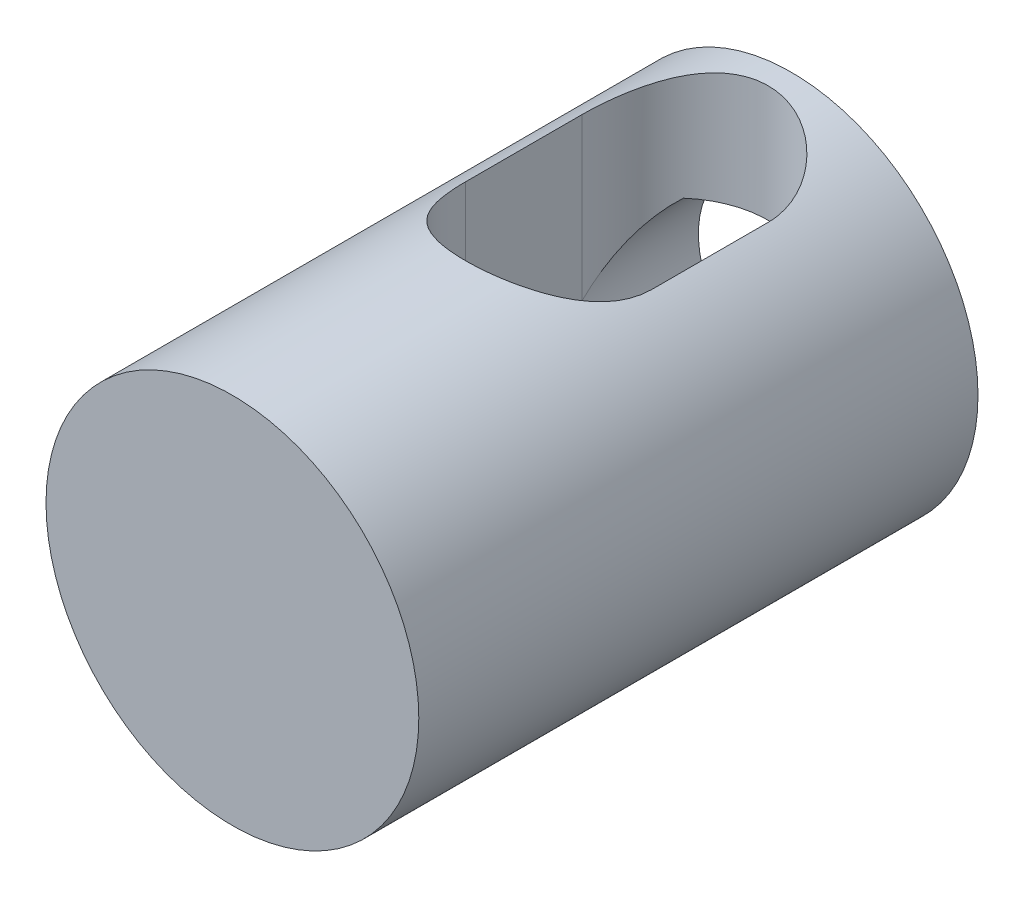
ISO-10303-21;
HEADER;
FILE_DESCRIPTION(('STEP AP214'),'2;1');
FILE_NAME('part.step','',(''),(''),'','','');
FILE_SCHEMA(('AUTOMOTIVE_DESIGN { 1 0 10303 214 1 1 1 1 }'));
ENDSEC;
DATA;
#1=APPLICATION_CONTEXT('core data for automotive mechanical design processes');
#2=APPLICATION_PROTOCOL_DEFINITION('international standard','automotive_design',2000,#1);
#3=PRODUCT_CONTEXT('',#1,'mechanical');
#4=PRODUCT('Part','Part','',(#3));
#5=PRODUCT_RELATED_PRODUCT_CATEGORY('part','',(#4));
#6=PRODUCT_DEFINITION_FORMATION('','',#4);
#7=PRODUCT_DEFINITION_CONTEXT('part definition',#1,'design');
#8=PRODUCT_DEFINITION('design','',#6,#7);
#9=PRODUCT_DEFINITION_SHAPE('','',#8);
#10=(LENGTH_UNIT() NAMED_UNIT(*) SI_UNIT(.MILLI.,.METRE.));
#11=(NAMED_UNIT(*) PLANE_ANGLE_UNIT() SI_UNIT($,.RADIAN.));
#12=(NAMED_UNIT(*) SI_UNIT($,.STERADIAN.) SOLID_ANGLE_UNIT());
#13=UNCERTAINTY_MEASURE_WITH_UNIT(LENGTH_MEASURE(1.E-05),#10,'distance_accuracy_value','');
#14=(GEOMETRIC_REPRESENTATION_CONTEXT(3) GLOBAL_UNCERTAINTY_ASSIGNED_CONTEXT((#13)) GLOBAL_UNIT_ASSIGNED_CONTEXT((#10,
#11,#12)) REPRESENTATION_CONTEXT('',''));
#15=CARTESIAN_POINT('',(0.,0.,0.));
#16=DIRECTION('',(0.,0.,1.));
#17=DIRECTION('',(1.,0.,0.));
#18=AXIS2_PLACEMENT_3D('',#15,#16,#17);
#19=CARTESIAN_POINT('',(-1.3228756555323,1.5,8.));
#20=DIRECTION('',(0.,1.,0.));
#21=DIRECTION('',(0.,0.,1.));
#22=AXIS2_PLACEMENT_3D('',#19,#20,#21);
#23=PLANE('',#22);
#24=DIRECTION('',(0.,0.,-1.));
#25=VECTOR('',#24,1.);
#26=CARTESIAN_POINT('',(1.3228756555323,1.5,8.));
#27=LINE('',#26,#25);
#28=CARTESIAN_POINT('',(1.3228756555323,1.5,1.));
#29=VERTEX_POINT('',#28);
#30=CARTESIAN_POINT('',(1.3228756555323,1.5,0.));
#31=VERTEX_POINT('',#30);
#32=EDGE_CURVE('E212',#29,#31,#27,.T.);
#33=ORIENTED_EDGE('',*,*,#32,.F.);
#34=CARTESIAN_POINT('',(0.,1.5,2.5));
#35=DIRECTION('',(0.,-1.,0.));
#36=DIRECTION('',(0.,0.,-1.));
#37=AXIS2_PLACEMENT_3D('',#34,#35,#36);
#38=CIRCLE('',#37,2.);
#39=CARTESIAN_POINT('',(-1.3228756555323,1.5,1.));
#40=VERTEX_POINT('',#39);
#41=EDGE_CURVE('E132',#40,#29,#38,.T.);
#42=ORIENTED_EDGE('',*,*,#41,.F.);
#43=DIRECTION('',(0.,0.,-1.));
#44=VECTOR('',#43,1.);
#45=CARTESIAN_POINT('',(-1.3228756555323,1.5,8.));
#46=LINE('',#45,#44);
#47=CARTESIAN_POINT('',(-1.3228756555323,1.5,0.));
#48=VERTEX_POINT('',#47);
#49=EDGE_CURVE('E213',#40,#48,#46,.T.);
#50=ORIENTED_EDGE('',*,*,#49,.T.);
#51=DIRECTION('',(1.,0.,0.));
#52=VECTOR('',#51,1.);
#53=CARTESIAN_POINT('',(-1.3228756555323,1.5,0.));
#54=LINE('',#53,#52);
#55=EDGE_CURVE('E196',#48,#31,#54,.T.);
#56=ORIENTED_EDGE('',*,*,#55,.T.);
#57=EDGE_LOOP('',(#33,#42,#50,#56));
#58=FACE_BOUND('',#57,.T.);
#59=ADVANCED_FACE('F37',(#58),#23,.F.);
#60=CARTESIAN_POINT('',(0.,0.,0.));
#61=DIRECTION('',(0.,0.,1.));
#62=DIRECTION('',(1.,0.,0.));
#63=AXIS2_PLACEMENT_3D('',#60,#61,#62);
#64=PLANE('',#63);
#65=CARTESIAN_POINT('',(0.,0.,0.));
#66=DIRECTION('',(0.,0.,1.));
#67=DIRECTION('',(1.,0.,0.));
#68=AXIS2_PLACEMENT_3D('',#65,#66,#67);
#69=CIRCLE('',#68,4.);
#70=CARTESIAN_POINT('',(4.,0.,0.));
#71=VERTEX_POINT('',#70);
#72=EDGE_CURVE('E42',#71,#71,#69,.T.);
#73=ORIENTED_EDGE('',*,*,#72,.F.);
#74=EDGE_LOOP('',(#73));
#75=FACE_BOUND('',#74,.T.);
#76=CARTESIAN_POINT('',(0.,0.,0.));
#77=DIRECTION('',(0.,0.,1.));
#78=DIRECTION('',(1.,0.,0.));
#79=AXIS2_PLACEMENT_3D('',#76,#77,#78);
#80=CIRCLE('',#79,2.);
#81=EDGE_CURVE('E194',#48,#31,#80,.T.);
#82=ORIENTED_EDGE('',*,*,#81,.T.);
#83=ORIENTED_EDGE('',*,*,#55,.F.);
#84=EDGE_LOOP('',(#82,#83));
#85=FACE_BOUND('',#84,.T.);
#86=ADVANCED_FACE('F178',(#75,#85),#64,.F.);
#87=CARTESIAN_POINT('',(0.,0.,12.));
#88=DIRECTION('',(0.,0.,-1.));
#89=DIRECTION('',(-1.,0.,0.));
#90=AXIS2_PLACEMENT_3D('',#87,#88,#89);
#91=CYLINDRICAL_SURFACE('',#90,4.);
#92=DIRECTION('',(0.,0.,-1.));
#93=VECTOR('',#92,1.);
#94=CARTESIAN_POINT('',(-2.,3.46410161513775,12.));
#95=LINE('',#94,#93);
#96=CARTESIAN_POINT('',(-2.,3.46410161513775,5.));
#97=VERTEX_POINT('',#96);
#98=CARTESIAN_POINT('',(-2.,3.46410161513775,2.5));
#99=VERTEX_POINT('',#98);
#100=EDGE_CURVE('E198',#97,#99,#95,.T.);
#101=ORIENTED_EDGE('',*,*,#100,.T.);
#102=CARTESIAN_POINT('',(-2.,3.46410161513775,2.5));
#103=CARTESIAN_POINT('',(-2.00000943869001,3.46408620970987,2.44762205197468));
#104=CARTESIAN_POINT('',(-1.99794273869158,3.46528916979241,2.39525266417875));
#105=CARTESIAN_POINT('',(-1.98973134530659,3.47001582547733,2.29097128012435));
#106=CARTESIAN_POINT('',(-1.98358915744987,3.47353809520359,2.23905902268741));
#107=CARTESIAN_POINT('',(-1.96734758392331,3.48276113120576,2.13636197380458));
#108=CARTESIAN_POINT('',(-1.95727108055602,3.48844929580341,2.08557242562939));
#109=CARTESIAN_POINT('',(-1.93329379612757,3.50179425827599,1.98517790872982));
#110=CARTESIAN_POINT('',(-1.91939257579649,3.5094512822684,1.93557307678209));
#111=CARTESIAN_POINT('',(-1.87223751000493,3.53496971479961,1.78922877472877));
#112=CARTESIAN_POINT('',(-1.83348206518134,3.55540886386695,1.69464885817499));
#113=CARTESIAN_POINT('',(-1.74260973580062,3.60081691495323,1.51326645129973));
#114=CARTESIAN_POINT('',(-1.69047214803723,3.62579281802088,1.42647629569109));
#115=CARTESIAN_POINT('',(-1.56932700935895,3.67994024124641,1.25538308608975));
#116=CARTESIAN_POINT('',(-1.49928845749502,3.70928784184414,1.17186401688438));
#117=CARTESIAN_POINT('',(-1.34648855278875,3.76744628526356,1.01716582823638));
#118=CARTESIAN_POINT('',(-1.2637237596621,3.79625698057539,0.945990056660703));
#119=CARTESIAN_POINT('',(-1.08097958990492,3.852429394718,0.813266342092416));
#120=CARTESIAN_POINT('',(-0.980215181611717,3.87956191127973,0.752693032009841));
#121=CARTESIAN_POINT('',(-0.768314880691173,3.92701497394428,0.64971851871349));
#122=CARTESIAN_POINT('',(-0.657185507148497,3.94733976534538,0.607305985825046));
#123=CARTESIAN_POINT('',(-0.436090764194855,3.97760910429472,0.544990946073144));
#124=CARTESIAN_POINT('',(-0.326605376453688,3.98818943198116,0.523701300599242));
#125=CARTESIAN_POINT('',(-0.105143090997525,4.00015165315059,0.499667803443515));
#126=CARTESIAN_POINT('',(0.00683230076447052,4.0015389624913,0.496913032347213));
#127=CARTESIAN_POINT('',(0.219666020360653,3.99525960973526,0.509493405564554));
#128=CARTESIAN_POINT('',(0.320644329924759,3.98836978544159,0.523276291844412));
#129=CARTESIAN_POINT('',(0.518629401924054,3.96748463780782,0.565762240252354));
#130=CARTESIAN_POINT('',(0.615635942593483,3.9534889182895,0.594466134280342));
#131=CARTESIAN_POINT('',(0.804618074137879,3.91943179430851,0.666164848265792));
#132=CARTESIAN_POINT('',(0.896505473959439,3.89928913517567,0.709351924229925));
#133=CARTESIAN_POINT('',(1.0719523739539,3.85475327589208,0.808526063503472));
#134=CARTESIAN_POINT('',(1.15550875300778,3.83035849206883,0.864517898283785));
#135=CARTESIAN_POINT('',(1.32034170525748,3.77688971838165,0.993786080741428));
#136=CARTESIAN_POINT('',(1.40065758878075,3.74759139866565,1.06819544818469));
#137=CARTESIAN_POINT('',(1.54820014968351,3.6890905267488,1.22916916122002));
#138=CARTESIAN_POINT('',(1.61541504384544,3.65988808377385,1.31574432958672));
#139=CARTESIAN_POINT('',(1.73905371288663,3.60286331192321,1.5053594541426));
#140=CARTESIAN_POINT('',(1.79450839108784,3.57524975585781,1.6090994171856));
#141=CARTESIAN_POINT('',(1.88669118631508,3.52747996877226,1.82604597477595));
#142=CARTESIAN_POINT('',(1.92346416437439,3.50730590530613,1.93922912407418));
#143=CARTESIAN_POINT('',(1.96647223368324,3.48329612458051,2.12782183056156));
#144=CARTESIAN_POINT('',(1.97899117486891,3.47616914725418,2.20142595230316));
#145=CARTESIAN_POINT('',(1.99577612591724,3.46654103519923,2.3499929359233));
#146=CARTESIAN_POINT('',(2.00002756701619,3.4640480667353,2.42495796182794));
#147=CARTESIAN_POINT('',(2.,3.46410161513775,2.5));
#148=B_SPLINE_CURVE_WITH_KNOTS('',3,(#102,#103,#104,#105,#106,#107,#108,#109,#110,#111,#112,
#113,#114,#115,#116,#117,#118,#119,#120,#121,#122,#123,#124,#125,#126,#127,#128,#129,#130,#131,
#132,#133,#134,#135,#136,#137,#138,#139,#140,#141,#142,#143,#144,#145,#146,#147),.UNSPECIFIED.,
.F.,.F.,(4,2,2,2,2,2,2,2,2,2,2,2,2,2,2,2,2,2,2,2,2,2,4),(0.,0.157065244429688,0.31403401759065,
0.470103130002185,0.626190174486594,0.937427814388438,1.24914989609589,1.58636722175674,
1.92367586815313,2.28376091120869,2.643620985295,2.97787141914153,3.31192491942518,
3.61692930404831,3.92195069558821,4.23119285312315,4.54055043268371,4.87912635702851,
5.21800541026928,5.57862778091816,5.93838003367367,6.16281283132481,6.38764076123999),.UNSPECIFIED.);
#149=CARTESIAN_POINT('',(2.,3.46410161513775,2.5));
#150=VERTEX_POINT('',#149);
#151=EDGE_CURVE('E147',#99,#150,#148,.T.);
#152=ORIENTED_EDGE('',*,*,#151,.T.);
#153=DIRECTION('',(0.,0.,-1.));
#154=VECTOR('',#153,1.);
#155=CARTESIAN_POINT('',(2.,3.46410161513775,12.));
#156=LINE('',#155,#154);
#157=CARTESIAN_POINT('',(2.,3.46410161513775,5.));
#158=VERTEX_POINT('',#157);
#159=EDGE_CURVE('E203',#150,#158,#156,.F.);
#160=ORIENTED_EDGE('',*,*,#159,.T.);
#161=CARTESIAN_POINT('',(2.,3.46410161513775,5.));
#162=CARTESIAN_POINT('',(2.00000943869001,3.46408620970987,5.05237794802532));
#163=CARTESIAN_POINT('',(1.99794273869158,3.46528916979241,5.10474733582125));
#164=CARTESIAN_POINT('',(1.98973134530659,3.47001582547733,5.20902871987565));
#165=CARTESIAN_POINT('',(1.98358915744987,3.47353809520359,5.26094097731259));
#166=CARTESIAN_POINT('',(1.96734758392331,3.48276113120576,5.36363802619542));
#167=CARTESIAN_POINT('',(1.95727108055602,3.48844929580341,5.41442757437061));
#168=CARTESIAN_POINT('',(1.93329379612757,3.50179425827599,5.51482209127018));
#169=CARTESIAN_POINT('',(1.91939257579648,3.5094512822684,5.56442692321791));
#170=CARTESIAN_POINT('',(1.87223751000493,3.53496971479961,5.71077122527123));
#171=CARTESIAN_POINT('',(1.83348206518134,3.55540886386695,5.80535114182501));
#172=CARTESIAN_POINT('',(1.74260973580062,3.60081691495323,5.98673354870027));
#173=CARTESIAN_POINT('',(1.69047214803722,3.62579281802088,6.07352370430891));
#174=CARTESIAN_POINT('',(1.56932700935895,3.67994024124641,6.24461691391025));
#175=CARTESIAN_POINT('',(1.49928845749502,3.70928784184414,6.32813598311562));
#176=CARTESIAN_POINT('',(1.34648855278875,3.76744628526356,6.48283417176362));
#177=CARTESIAN_POINT('',(1.2637237596621,3.79625698057539,6.5540099433393));
#178=CARTESIAN_POINT('',(1.08097958990492,3.852429394718,6.68673365790758));
#179=CARTESIAN_POINT('',(0.980215181611715,3.87956191127973,6.74730696799016));
#180=CARTESIAN_POINT('',(0.768314880691171,3.92701497394428,6.85028148128651));
#181=CARTESIAN_POINT('',(0.657185507148495,3.94733976534538,6.89269401417496));
#182=CARTESIAN_POINT('',(0.436090764194853,3.97760910429472,6.95500905392686));
#183=CARTESIAN_POINT('',(0.326605376453686,3.98818943198116,6.97629869940076));
#184=CARTESIAN_POINT('',(0.105143090997523,4.00015165315059,7.00033219655649));
#185=CARTESIAN_POINT('',(-0.00683230076447186,4.0015389624913,7.00308696765279));
#186=CARTESIAN_POINT('',(-0.219666020360655,3.99525960973526,6.99050659443545));
#187=CARTESIAN_POINT('',(-0.32064432992476,3.98836978544159,6.97672370815559));
#188=CARTESIAN_POINT('',(-0.518629401924055,3.96748463780782,6.93423775974765));
#189=CARTESIAN_POINT('',(-0.615635942593484,3.9534889182895,6.90553386571966));
#190=CARTESIAN_POINT('',(-0.80461807413788,3.91943179430851,6.83383515173421));
#191=CARTESIAN_POINT('',(-0.896505473959441,3.89928913517567,6.79064807577007));
#192=CARTESIAN_POINT('',(-1.07195237395391,3.85475327589208,6.69147393649653));
#193=CARTESIAN_POINT('',(-1.15550875300778,3.83035849206883,6.63548210171621));
#194=CARTESIAN_POINT('',(-1.32034170525748,3.77688971838165,6.50621391925857));
#195=CARTESIAN_POINT('',(-1.40065758878075,3.74759139866565,6.43180455181531));
#196=CARTESIAN_POINT('',(-1.54820014968351,3.6890905267488,6.27083083877998));
#197=CARTESIAN_POINT('',(-1.61541504384545,3.65988808377385,6.18425567041327));
#198=CARTESIAN_POINT('',(-1.73905371288663,3.60286331192321,5.99464054585739));
#199=CARTESIAN_POINT('',(-1.79450839108784,3.57524975585781,5.8909005828144));
#200=CARTESIAN_POINT('',(-1.88669118631508,3.52747996877226,5.67395402522404));
#201=CARTESIAN_POINT('',(-1.92346416437439,3.50730590530613,5.56077087592581));
#202=CARTESIAN_POINT('',(-1.96647223368324,3.48329612458051,5.37217816943843));
#203=CARTESIAN_POINT('',(-1.97899117486891,3.47616914725418,5.29857404769684));
#204=CARTESIAN_POINT('',(-1.99577612591724,3.46654103519923,5.1500070640767));
#205=CARTESIAN_POINT('',(-2.00002756701619,3.4640480667353,5.07504203817206));
#206=CARTESIAN_POINT('',(-2.,3.46410161513775,5.));
#207=B_SPLINE_CURVE_WITH_KNOTS('',3,(#161,#162,#163,#164,#165,#166,#167,#168,#169,#170,#171,
#172,#173,#174,#175,#176,#177,#178,#179,#180,#181,#182,#183,#184,#185,#186,#187,#188,#189,#190,
#191,#192,#193,#194,#195,#196,#197,#198,#199,#200,#201,#202,#203,#204,#205,#206),.UNSPECIFIED.,
.F.,.F.,(4,2,2,2,2,2,2,2,2,2,2,2,2,2,2,2,2,2,2,2,2,2,4),(0.,0.157065244429687,0.31403401759065,
0.470103130002185,0.626190174486595,0.937427814388438,1.24914989609589,1.58636722175674,
1.92367586815313,2.2837609112087,2.643620985295,2.97787141914153,3.31192491942518,
3.61692930404831,3.92195069558821,4.23119285312315,4.54055043268371,4.87912635702851,
5.21800541026929,5.57862778091816,5.93838003367367,6.16281283132481,6.38764076123999),.UNSPECIFIED.);
#208=EDGE_CURVE('E103',#158,#97,#207,.T.);
#209=ORIENTED_EDGE('',*,*,#208,.T.);
#210=EDGE_LOOP('',(#101,#152,#160,#209));
#211=FACE_BOUND('',#210,.T.);
#212=CARTESIAN_POINT('',(0.,0.,12.));
#213=DIRECTION('',(0.,0.,1.));
#214=DIRECTION('',(1.,0.,0.));
#215=AXIS2_PLACEMENT_3D('',#212,#213,#214);
#216=CIRCLE('',#215,4.);
#217=CARTESIAN_POINT('',(4.,0.,12.));
#218=VERTEX_POINT('',#217);
#219=EDGE_CURVE('E11',#218,#218,#216,.T.);
#220=ORIENTED_EDGE('',*,*,#219,.F.);
#221=EDGE_LOOP('',(#220));
#222=FACE_BOUND('',#221,.T.);
#223=ORIENTED_EDGE('',*,*,#72,.T.);
#224=EDGE_LOOP('',(#223));
#225=FACE_BOUND('',#224,.T.);
#226=ADVANCED_FACE('F39',(#211,#222,#225),#91,.T.);
#227=CARTESIAN_POINT('',(0.,0.,12.));
#228=DIRECTION('',(0.,0.,1.));
#229=DIRECTION('',(1.,0.,0.));
#230=AXIS2_PLACEMENT_3D('',#227,#228,#229);
#231=PLANE('',#230);
#232=ORIENTED_EDGE('',*,*,#219,.T.);
#233=EDGE_LOOP('',(#232));
#234=FACE_BOUND('',#233,.T.);
#235=ADVANCED_FACE('F175',(#234),#231,.T.);
#236=CARTESIAN_POINT('',(0.,0.,8.));
#237=DIRECTION('',(0.,0.,-1.));
#238=DIRECTION('',(-1.,0.,0.));
#239=AXIS2_PLACEMENT_3D('',#236,#237,#238);
#240=CYLINDRICAL_SURFACE('',#239,2.);
#241=CARTESIAN_POINT('',(0.,0.,2.5));
#242=DIRECTION('',(0.,0.707106781186547,0.707106781186548));
#243=DIRECTION('',(0.,0.707106781186547,-0.707106781186548));
#244=AXIS2_PLACEMENT_3D('',#241,#242,#243);
#245=ELLIPSE('',#244,2.82842712474619,2.);
#246=CARTESIAN_POINT('',(-2.,0.,2.5));
#247=VERTEX_POINT('',#246);
#248=EDGE_CURVE('E125',#247,#40,#245,.F.);
#249=ORIENTED_EDGE('',*,*,#248,.F.);
#250=DIRECTION('',(0.,0.,-1.));
#251=VECTOR('',#250,1.);
#252=CARTESIAN_POINT('',(-2.,0.,8.));
#253=LINE('',#252,#251);
#254=CARTESIAN_POINT('',(-2.,0.,5.));
#255=VERTEX_POINT('',#254);
#256=EDGE_CURVE('E130',#247,#255,#253,.F.);
#257=ORIENTED_EDGE('',*,*,#256,.T.);
#258=CARTESIAN_POINT('',(0.,0.,5.));
#259=DIRECTION('',(0.,0.707106781186547,-0.707106781186548));
#260=DIRECTION('',(0.,0.707106781186547,0.707106781186548));
#261=AXIS2_PLACEMENT_3D('',#258,#259,#260);
#262=ELLIPSE('',#261,2.82842712474619,2.);
#263=CARTESIAN_POINT('',(-1.3228756555323,1.5,6.5));
#264=VERTEX_POINT('',#263);
#265=EDGE_CURVE('E122',#264,#255,#262,.F.);
#266=ORIENTED_EDGE('',*,*,#265,.F.);
#267=CARTESIAN_POINT('',(-1.3228756555323,1.5,8.));
#268=VERTEX_POINT('',#267);
#269=EDGE_CURVE('E209',#268,#264,#46,.T.);
#270=ORIENTED_EDGE('',*,*,#269,.F.);
#271=CARTESIAN_POINT('',(0.,0.,8.));
#272=DIRECTION('',(0.,0.,1.));
#273=DIRECTION('',(1.,0.,0.));
#274=AXIS2_PLACEMENT_3D('',#271,#272,#273);
#275=CIRCLE('',#274,2.);
#276=CARTESIAN_POINT('',(1.3228756555323,1.5,8.));
#277=VERTEX_POINT('',#276);
#278=EDGE_CURVE('E200',#268,#277,#275,.T.);
#279=ORIENTED_EDGE('',*,*,#278,.T.);
#280=CARTESIAN_POINT('',(1.3228756555323,1.5,6.5));
#281=VERTEX_POINT('',#280);
#282=EDGE_CURVE('E121',#277,#281,#27,.T.);
#283=ORIENTED_EDGE('',*,*,#282,.T.);
#284=CARTESIAN_POINT('',(0.,0.,5.));
#285=DIRECTION('',(0.,0.707106781186547,-0.707106781186548));
#286=DIRECTION('',(0.,0.707106781186547,0.707106781186548));
#287=AXIS2_PLACEMENT_3D('',#284,#285,#286);
#288=ELLIPSE('',#287,2.82842712474619,2.);
#289=CARTESIAN_POINT('',(2.,0.,5.));
#290=VERTEX_POINT('',#289);
#291=EDGE_CURVE('E60',#290,#281,#288,.F.);
#292=ORIENTED_EDGE('',*,*,#291,.F.);
#293=DIRECTION('',(0.,0.,-1.));
#294=VECTOR('',#293,1.);
#295=CARTESIAN_POINT('',(2.,0.,8.));
#296=LINE('',#295,#294);
#297=CARTESIAN_POINT('',(2.,0.,2.5));
#298=VERTEX_POINT('',#297);
#299=EDGE_CURVE('E109',#298,#290,#296,.F.);
#300=ORIENTED_EDGE('',*,*,#299,.F.);
#301=CARTESIAN_POINT('',(0.,0.,2.5));
#302=DIRECTION('',(0.,0.707106781186547,0.707106781186548));
#303=DIRECTION('',(0.,0.707106781186547,-0.707106781186548));
#304=AXIS2_PLACEMENT_3D('',#301,#302,#303);
#305=ELLIPSE('',#304,2.82842712474619,2.);
#306=EDGE_CURVE('E115',#29,#298,#305,.F.);
#307=ORIENTED_EDGE('',*,*,#306,.F.);
#308=ORIENTED_EDGE('',*,*,#32,.T.);
#309=ORIENTED_EDGE('',*,*,#81,.F.);
#310=ORIENTED_EDGE('',*,*,#49,.F.);
#311=EDGE_LOOP('',(#249,#257,#266,#270,#279,#283,#292,#300,#307,#308,#309,#310));
#312=FACE_BOUND('',#311,.T.);
#313=ADVANCED_FACE('F119',(#312),#240,.F.);
#314=ORIENTED_EDGE('',*,*,#269,.T.);
#315=CARTESIAN_POINT('',(0.,1.5,5.));
#316=DIRECTION('',(0.,-1.,0.));
#317=DIRECTION('',(0.,0.,-1.));
#318=AXIS2_PLACEMENT_3D('',#315,#316,#317);
#319=CIRCLE('',#318,2.);
#320=EDGE_CURVE('E135',#281,#264,#319,.T.);
#321=ORIENTED_EDGE('',*,*,#320,.F.);
#322=ORIENTED_EDGE('',*,*,#282,.F.);
#323=DIRECTION('',(1.,0.,0.));
#324=VECTOR('',#323,1.);
#325=CARTESIAN_POINT('',(-1.3228756555323,1.5,8.));
#326=LINE('',#325,#324);
#327=EDGE_CURVE('E206',#268,#277,#326,.T.);
#328=ORIENTED_EDGE('',*,*,#327,.F.);
#329=EDGE_LOOP('',(#314,#321,#322,#328));
#330=FACE_BOUND('',#329,.T.);
#331=ADVANCED_FACE('F168',(#330),#23,.F.);
#332=CARTESIAN_POINT('',(0.,0.,8.));
#333=DIRECTION('',(0.,0.,1.));
#334=DIRECTION('',(1.,0.,0.));
#335=AXIS2_PLACEMENT_3D('',#332,#333,#334);
#336=PLANE('',#335);
#337=ORIENTED_EDGE('',*,*,#278,.F.);
#338=ORIENTED_EDGE('',*,*,#327,.T.);
#339=EDGE_LOOP('',(#337,#338));
#340=FACE_BOUND('',#339,.T.);
#341=ADVANCED_FACE('F165',(#340),#336,.F.);
#342=CARTESIAN_POINT('',(-2.,9.5,2.5));
#343=DIRECTION('',(-1.,0.,0.));
#344=DIRECTION('',(0.,0.,1.));
#345=AXIS2_PLACEMENT_3D('',#342,#343,#344);
#346=PLANE('',#345);
#347=DIRECTION('',(0.,-1.,0.));
#348=VECTOR('',#347,1.);
#349=CARTESIAN_POINT('',(-2.,9.5,5.));
#350=LINE('',#349,#348);
#351=EDGE_CURVE('E105',#97,#255,#350,.T.);
#352=ORIENTED_EDGE('',*,*,#351,.T.);
#353=ORIENTED_EDGE('',*,*,#256,.F.);
#354=DIRECTION('',(0.,-1.,0.));
#355=VECTOR('',#354,1.);
#356=CARTESIAN_POINT('',(-2.,9.5,2.5));
#357=LINE('',#356,#355);
#358=EDGE_CURVE('E137',#99,#247,#357,.T.);
#359=ORIENTED_EDGE('',*,*,#358,.F.);
#360=ORIENTED_EDGE('',*,*,#100,.F.);
#361=EDGE_LOOP('',(#352,#353,#359,#360));
#362=FACE_BOUND('',#361,.T.);
#363=ADVANCED_FACE('F159',(#362),#346,.F.);
#364=CARTESIAN_POINT('',(2.,9.5,2.5));
#365=DIRECTION('',(1.,0.,0.));
#366=DIRECTION('',(0.,0.,-1.));
#367=AXIS2_PLACEMENT_3D('',#364,#365,#366);
#368=PLANE('',#367);
#369=DIRECTION('',(0.,-1.,0.));
#370=VECTOR('',#369,1.);
#371=CARTESIAN_POINT('',(2.,9.5,2.5));
#372=LINE('',#371,#370);
#373=EDGE_CURVE('E106',#150,#298,#372,.T.);
#374=ORIENTED_EDGE('',*,*,#373,.T.);
#375=ORIENTED_EDGE('',*,*,#299,.T.);
#376=DIRECTION('',(0.,-1.,0.));
#377=VECTOR('',#376,1.);
#378=CARTESIAN_POINT('',(2.,9.5,5.));
#379=LINE('',#378,#377);
#380=EDGE_CURVE('E53',#158,#290,#379,.T.);
#381=ORIENTED_EDGE('',*,*,#380,.F.);
#382=ORIENTED_EDGE('',*,*,#159,.F.);
#383=EDGE_LOOP('',(#374,#375,#381,#382));
#384=FACE_BOUND('',#383,.T.);
#385=ADVANCED_FACE('F110',(#384),#368,.F.);
#386=CARTESIAN_POINT('',(0.,9.5,2.5));
#387=DIRECTION('',(0.,-1.,0.));
#388=DIRECTION('',(0.,0.,-1.));
#389=AXIS2_PLACEMENT_3D('',#386,#387,#388);
#390=CYLINDRICAL_SURFACE('',#389,2.);
#391=ORIENTED_EDGE('',*,*,#358,.T.);
#392=ORIENTED_EDGE('',*,*,#248,.T.);
#393=ORIENTED_EDGE('',*,*,#41,.T.);
#394=ORIENTED_EDGE('',*,*,#306,.T.);
#395=ORIENTED_EDGE('',*,*,#373,.F.);
#396=ORIENTED_EDGE('',*,*,#151,.F.);
#397=EDGE_LOOP('',(#391,#392,#393,#394,#395,#396));
#398=FACE_BOUND('',#397,.T.);
#399=ADVANCED_FACE('F158',(#398),#390,.F.);
#400=CARTESIAN_POINT('',(0.,9.5,5.));
#401=DIRECTION('',(0.,-1.,0.));
#402=DIRECTION('',(0.,0.,-1.));
#403=AXIS2_PLACEMENT_3D('',#400,#401,#402);
#404=CYLINDRICAL_SURFACE('',#403,2.);
#405=ORIENTED_EDGE('',*,*,#380,.T.);
#406=ORIENTED_EDGE('',*,*,#291,.T.);
#407=ORIENTED_EDGE('',*,*,#320,.T.);
#408=ORIENTED_EDGE('',*,*,#265,.T.);
#409=ORIENTED_EDGE('',*,*,#351,.F.);
#410=ORIENTED_EDGE('',*,*,#208,.F.);
#411=EDGE_LOOP('',(#405,#406,#407,#408,#409,#410));
#412=FACE_BOUND('',#411,.T.);
#413=ADVANCED_FACE('F100',(#412),#404,.F.);
#414=CLOSED_SHELL('',(#59,#86,#226,#235,#313,#331,#341,#363,#385,#399,#413));
#415=MANIFOLD_SOLID_BREP('B2',#414);
#416=ADVANCED_BREP_SHAPE_REPRESENTATION('',(#18,#415),#14);
#417=SHAPE_DEFINITION_REPRESENTATION(#9,#416);
ENDSEC;
END-ISO-10303-21;
